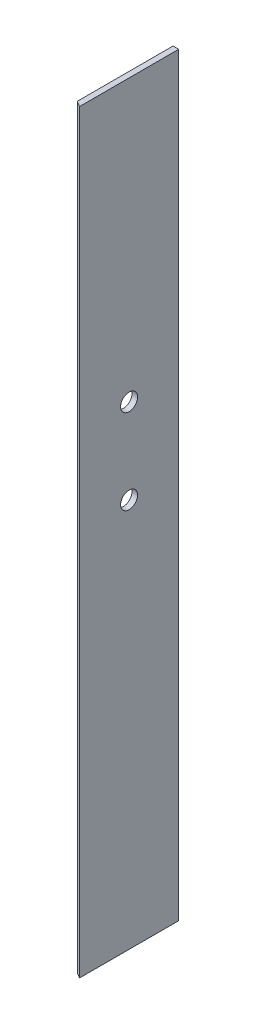
ISO-10303-21;
HEADER;
FILE_DESCRIPTION(('STEP AP214'),'2;1');
FILE_NAME('part.step','',(''),(''),'','','');
FILE_SCHEMA(('AUTOMOTIVE_DESIGN { 1 0 10303 214 1 1 1 1 }'));
ENDSEC;
DATA;
#1=APPLICATION_CONTEXT('core data for automotive mechanical design processes');
#2=APPLICATION_PROTOCOL_DEFINITION('international standard','automotive_design',2000,#1);
#3=PRODUCT_CONTEXT('',#1,'mechanical');
#4=PRODUCT('Part','Part','',(#3));
#5=PRODUCT_RELATED_PRODUCT_CATEGORY('part','',(#4));
#6=PRODUCT_DEFINITION_FORMATION('','',#4);
#7=PRODUCT_DEFINITION_CONTEXT('part definition',#1,'design');
#8=PRODUCT_DEFINITION('design','',#6,#7);
#9=PRODUCT_DEFINITION_SHAPE('','',#8);
#10=(LENGTH_UNIT() NAMED_UNIT(*) SI_UNIT(.MILLI.,.METRE.));
#11=(NAMED_UNIT(*) PLANE_ANGLE_UNIT() SI_UNIT($,.RADIAN.));
#12=(NAMED_UNIT(*) SI_UNIT($,.STERADIAN.) SOLID_ANGLE_UNIT());
#13=UNCERTAINTY_MEASURE_WITH_UNIT(LENGTH_MEASURE(1.E-05),#10,'distance_accuracy_value','');
#14=(GEOMETRIC_REPRESENTATION_CONTEXT(3) GLOBAL_UNCERTAINTY_ASSIGNED_CONTEXT((#13)) GLOBAL_UNIT_ASSIGNED_CONTEXT((#10,
#11,#12)) REPRESENTATION_CONTEXT('',''));
#15=CARTESIAN_POINT('',(0.,0.,0.));
#16=DIRECTION('',(0.,0.,1.));
#17=DIRECTION('',(1.,0.,0.));
#18=AXIS2_PLACEMENT_3D('',#15,#16,#17);
#19=CARTESIAN_POINT('',(0.999999999999996,603.396562455359,0.));
#20=DIRECTION('',(1.,0.,0.));
#21=DIRECTION('',(0.,0.,-1.));
#22=AXIS2_PLACEMENT_3D('',#19,#20,#21);
#23=PLANE('',#22);
#24=CARTESIAN_POINT('',(0.999999999999996,275.,35.034404261569));
#25=DIRECTION('',(1.,0.,0.));
#26=DIRECTION('',(0.,0.,-1.));
#27=AXIS2_PLACEMENT_3D('',#24,#25,#26);
#28=CIRCLE('',#27,6.);
#29=CARTESIAN_POINT('',(0.999999999999996,275.,29.034404261569));
#30=VERTEX_POINT('',#29);
#31=EDGE_CURVE('E110',#30,#30,#28,.T.);
#32=ORIENTED_EDGE('',*,*,#31,.T.);
#33=EDGE_LOOP('',(#32));
#34=FACE_BOUND('',#33,.T.);
#35=CARTESIAN_POINT('',(0.999999999999996,335.,35.034404261569));
#36=DIRECTION('',(1.,0.,0.));
#37=DIRECTION('',(0.,0.,-1.));
#38=AXIS2_PLACEMENT_3D('',#35,#36,#37);
#39=CIRCLE('',#38,6.);
#40=CARTESIAN_POINT('',(0.999999999999996,335.,29.034404261569));
#41=VERTEX_POINT('',#40);
#42=EDGE_CURVE('E85',#41,#41,#39,.T.);
#43=ORIENTED_EDGE('',*,*,#42,.T.);
#44=EDGE_LOOP('',(#43));
#45=FACE_BOUND('',#44,.T.);
#46=DIRECTION('',(0.,0.,1.));
#47=VECTOR('',#46,1.);
#48=CARTESIAN_POINT('',(0.999999999999996,533.213673316679,0.));
#49=LINE('',#48,#47);
#50=CARTESIAN_POINT('',(0.999999999999996,533.213673316679,0.));
#51=VERTEX_POINT('',#50);
#52=CARTESIAN_POINT('',(0.999999999999996,533.213673316679,67.6360015143482));
#53=VERTEX_POINT('',#52);
#54=EDGE_CURVE('E83',#51,#53,#49,.T.);
#55=ORIENTED_EDGE('',*,*,#54,.F.);
#56=DIRECTION('',(0.,-1.,0.));
#57=VECTOR('',#56,1.);
#58=CARTESIAN_POINT('',(0.999999999999996,603.396562455359,0.));
#59=LINE('',#58,#57);
#60=CARTESIAN_POINT('',(0.999999999999996,0.,0.));
#61=VERTEX_POINT('',#60);
#62=EDGE_CURVE('E37',#51,#61,#59,.T.);
#63=ORIENTED_EDGE('',*,*,#62,.T.);
#64=DIRECTION('',(0.,0.,1.));
#65=VECTOR('',#64,1.);
#66=CARTESIAN_POINT('',(0.999999999999996,0.,0.));
#67=LINE('',#66,#65);
#68=CARTESIAN_POINT('',(0.999999999999996,0.,67.6360015143482));
#69=VERTEX_POINT('',#68);
#70=EDGE_CURVE('E81',#61,#69,#67,.T.);
#71=ORIENTED_EDGE('',*,*,#70,.T.);
#72=DIRECTION('',(0.,-1.,0.));
#73=VECTOR('',#72,1.);
#74=CARTESIAN_POINT('',(0.999999999999996,603.396562455359,67.6360015143482));
#75=LINE('',#74,#73);
#76=EDGE_CURVE('E72',#53,#69,#75,.T.);
#77=ORIENTED_EDGE('',*,*,#76,.F.);
#78=EDGE_LOOP('',(#55,#63,#71,#77));
#79=FACE_BOUND('',#78,.T.);
#80=ADVANCED_FACE('F33',(#34,#45,#79),#23,.F.);
#81=CARTESIAN_POINT('',(0.999999999999996,603.396562455359,67.6360015143482));
#82=DIRECTION('',(0.519639012363709,0.,-0.854385917972475));
#83=DIRECTION('',(-0.854385917972475,0.,-0.519639012363709));
#84=AXIS2_PLACEMENT_3D('',#81,#82,#83);
#85=PLANE('',#84);
#86=DIRECTION('',(0.854385917972475,0.,0.519639012363709));
#87=VECTOR('',#86,1.);
#88=CARTESIAN_POINT('',(0.999999999999992,533.213673316679,67.6360015143482));
#89=LINE('',#88,#87);
#90=CARTESIAN_POINT('',(5.,533.213673316679,70.0688085231381));
#91=VERTEX_POINT('',#90);
#92=EDGE_CURVE('E42',#53,#91,#89,.T.);
#93=ORIENTED_EDGE('',*,*,#92,.F.);
#94=ORIENTED_EDGE('',*,*,#76,.T.);
#95=DIRECTION('',(0.854385917972475,0.,0.519639012363709));
#96=VECTOR('',#95,1.);
#97=CARTESIAN_POINT('',(0.999999999999996,0.,67.6360015143482));
#98=LINE('',#97,#96);
#99=CARTESIAN_POINT('',(5.,0.,70.0688085231381));
#100=VERTEX_POINT('',#99);
#101=EDGE_CURVE('E94',#69,#100,#98,.T.);
#102=ORIENTED_EDGE('',*,*,#101,.T.);
#103=DIRECTION('',(0.,-1.,0.));
#104=VECTOR('',#103,1.);
#105=CARTESIAN_POINT('',(5.,603.396562455359,70.0688085231381));
#106=LINE('',#105,#104);
#107=EDGE_CURVE('E103',#91,#100,#106,.T.);
#108=ORIENTED_EDGE('',*,*,#107,.F.);
#109=EDGE_LOOP('',(#93,#94,#102,#108));
#110=FACE_BOUND('',#109,.T.);
#111=ADVANCED_FACE('F131',(#110),#85,.F.);
#112=CARTESIAN_POINT('',(5.,603.396562455359,0.));
#113=DIRECTION('',(-1.,0.,0.));
#114=DIRECTION('',(0.,0.,1.));
#115=AXIS2_PLACEMENT_3D('',#112,#113,#114);
#116=PLANE('',#115);
#117=CARTESIAN_POINT('',(5.,275.,35.034404261569));
#118=DIRECTION('',(1.,0.,0.));
#119=DIRECTION('',(0.,0.,-1.));
#120=AXIS2_PLACEMENT_3D('',#117,#118,#119);
#121=CIRCLE('',#120,6.);
#122=CARTESIAN_POINT('',(5.,275.,29.034404261569));
#123=VERTEX_POINT('',#122);
#124=EDGE_CURVE('E113',#123,#123,#121,.T.);
#125=ORIENTED_EDGE('',*,*,#124,.F.);
#126=EDGE_LOOP('',(#125));
#127=FACE_BOUND('',#126,.T.);
#128=CARTESIAN_POINT('',(5.,335.,35.034404261569));
#129=DIRECTION('',(1.,0.,0.));
#130=DIRECTION('',(0.,0.,-1.));
#131=AXIS2_PLACEMENT_3D('',#128,#129,#130);
#132=CIRCLE('',#131,6.);
#133=CARTESIAN_POINT('',(5.,335.,29.034404261569));
#134=VERTEX_POINT('',#133);
#135=EDGE_CURVE('E107',#134,#134,#132,.T.);
#136=ORIENTED_EDGE('',*,*,#135,.F.);
#137=EDGE_LOOP('',(#136));
#138=FACE_BOUND('',#137,.T.);
#139=DIRECTION('',(0.,0.,-1.));
#140=VECTOR('',#139,1.);
#141=CARTESIAN_POINT('',(5.,533.213673316679,0.));
#142=LINE('',#141,#140);
#143=CARTESIAN_POINT('',(5.,533.213673316679,0.));
#144=VERTEX_POINT('',#143);
#145=EDGE_CURVE('E11',#91,#144,#142,.T.);
#146=ORIENTED_EDGE('',*,*,#145,.F.);
#147=ORIENTED_EDGE('',*,*,#107,.T.);
#148=DIRECTION('',(0.,0.,-1.));
#149=VECTOR('',#148,1.);
#150=CARTESIAN_POINT('',(5.,0.,0.));
#151=LINE('',#150,#149);
#152=CARTESIAN_POINT('',(5.,0.,0.));
#153=VERTEX_POINT('',#152);
#154=EDGE_CURVE('E104',#100,#153,#151,.T.);
#155=ORIENTED_EDGE('',*,*,#154,.T.);
#156=DIRECTION('',(0.,-1.,0.));
#157=VECTOR('',#156,1.);
#158=CARTESIAN_POINT('',(5.,603.396562455359,0.));
#159=LINE('',#158,#157);
#160=EDGE_CURVE('E55',#144,#153,#159,.T.);
#161=ORIENTED_EDGE('',*,*,#160,.F.);
#162=EDGE_LOOP('',(#146,#147,#155,#161));
#163=FACE_BOUND('',#162,.T.);
#164=ADVANCED_FACE('F128',(#127,#138,#163),#116,.F.);
#165=CARTESIAN_POINT('',(0.999999999999996,603.396562455359,0.));
#166=DIRECTION('',(0.,0.,1.));
#167=DIRECTION('',(1.,0.,0.));
#168=AXIS2_PLACEMENT_3D('',#165,#166,#167);
#169=PLANE('',#168);
#170=DIRECTION('',(-1.,0.,0.));
#171=VECTOR('',#170,1.);
#172=CARTESIAN_POINT('',(0.999999999999997,533.213673316679,0.));
#173=LINE('',#172,#171);
#174=EDGE_CURVE('E91',#144,#51,#173,.T.);
#175=ORIENTED_EDGE('',*,*,#174,.F.);
#176=ORIENTED_EDGE('',*,*,#160,.T.);
#177=DIRECTION('',(-1.,0.,0.));
#178=VECTOR('',#177,1.);
#179=CARTESIAN_POINT('',(0.999999999999996,0.,0.));
#180=LINE('',#179,#178);
#181=EDGE_CURVE('E87',#153,#61,#180,.T.);
#182=ORIENTED_EDGE('',*,*,#181,.T.);
#183=ORIENTED_EDGE('',*,*,#62,.F.);
#184=EDGE_LOOP('',(#175,#176,#182,#183));
#185=FACE_BOUND('',#184,.T.);
#186=ADVANCED_FACE('F88',(#185),#169,.F.);
#187=CARTESIAN_POINT('',(0.999999999999996,0.,0.));
#188=DIRECTION('',(0.,1.,0.));
#189=DIRECTION('',(0.,0.,1.));
#190=AXIS2_PLACEMENT_3D('',#187,#188,#189);
#191=PLANE('',#190);
#192=ORIENTED_EDGE('',*,*,#70,.F.);
#193=ORIENTED_EDGE('',*,*,#181,.F.);
#194=ORIENTED_EDGE('',*,*,#154,.F.);
#195=ORIENTED_EDGE('',*,*,#101,.F.);
#196=EDGE_LOOP('',(#192,#193,#194,#195));
#197=FACE_BOUND('',#196,.T.);
#198=ADVANCED_FACE('F93',(#197),#191,.F.);
#199=CARTESIAN_POINT('',(-120.760604365882,533.213673316679,-36.5841933520334));
#200=DIRECTION('',(0.,1.,0.));
#201=DIRECTION('',(0.,0.,-1.));
#202=AXIS2_PLACEMENT_3D('',#199,#200,#201);
#203=PLANE('',#202);
#204=ORIENTED_EDGE('',*,*,#174,.T.);
#205=ORIENTED_EDGE('',*,*,#54,.T.);
#206=ORIENTED_EDGE('',*,*,#92,.T.);
#207=ORIENTED_EDGE('',*,*,#145,.T.);
#208=EDGE_LOOP('',(#204,#205,#206,#207));
#209=FACE_BOUND('',#208,.T.);
#210=ADVANCED_FACE('F35',(#209),#203,.T.);
#211=CARTESIAN_POINT('',(0.999999999999996,335.,35.034404261569));
#212=DIRECTION('',(1.,0.,0.));
#213=DIRECTION('',(0.,0.,-1.));
#214=AXIS2_PLACEMENT_3D('',#211,#212,#213);
#215=CYLINDRICAL_SURFACE('',#214,6.);
#216=ORIENTED_EDGE('',*,*,#42,.F.);
#217=EDGE_LOOP('',(#216));
#218=FACE_BOUND('',#217,.T.);
#219=ORIENTED_EDGE('',*,*,#135,.T.);
#220=EDGE_LOOP('',(#219));
#221=FACE_BOUND('',#220,.T.);
#222=ADVANCED_FACE('F124',(#218,#221),#215,.F.);
#223=CARTESIAN_POINT('',(0.999999999999996,275.,35.034404261569));
#224=DIRECTION('',(1.,0.,0.));
#225=DIRECTION('',(0.,0.,-1.));
#226=AXIS2_PLACEMENT_3D('',#223,#224,#225);
#227=CYLINDRICAL_SURFACE('',#226,6.);
#228=ORIENTED_EDGE('',*,*,#31,.F.);
#229=EDGE_LOOP('',(#228));
#230=FACE_BOUND('',#229,.T.);
#231=ORIENTED_EDGE('',*,*,#124,.T.);
#232=EDGE_LOOP('',(#231));
#233=FACE_BOUND('',#232,.T.);
#234=ADVANCED_FACE('F121',(#230,#233),#227,.F.);
#235=CLOSED_SHELL('',(#80,#111,#164,#186,#198,#210,#222,#234));
#236=MANIFOLD_SOLID_BREP('B2',#235);
#237=ADVANCED_BREP_SHAPE_REPRESENTATION('',(#18,#236),#14);
#238=SHAPE_DEFINITION_REPRESENTATION(#9,#237);
ENDSEC;
END-ISO-10303-21;
